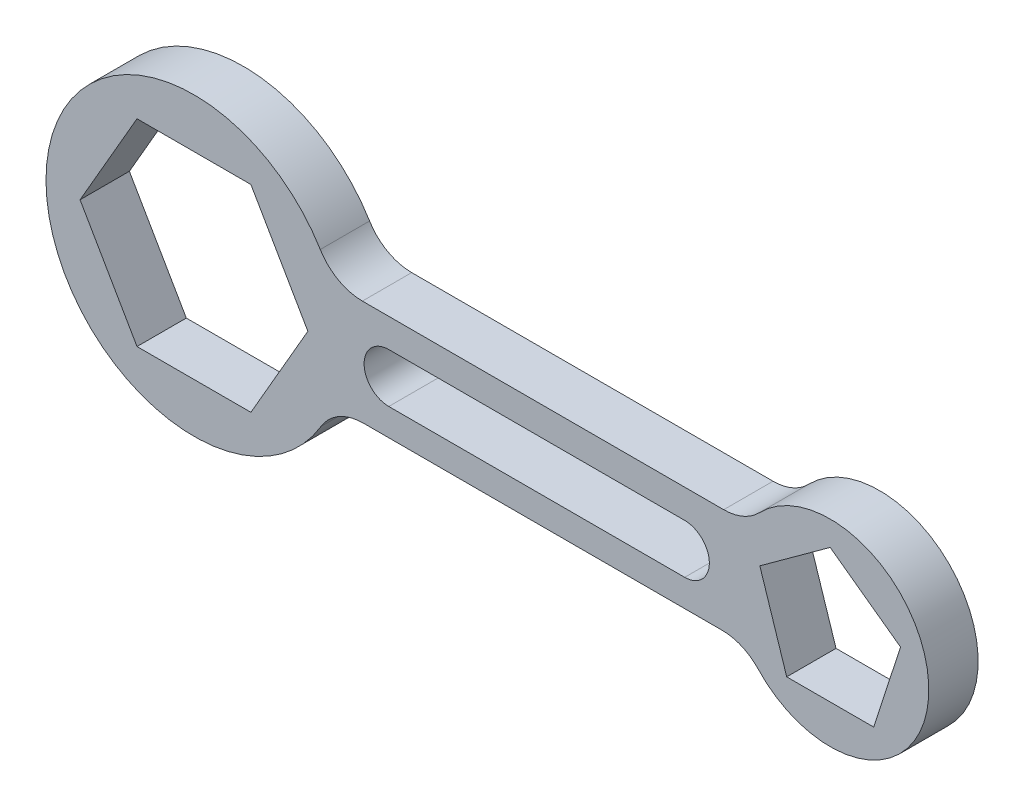
ISO-10303-21;
HEADER;
FILE_DESCRIPTION(('STEP AP214'),'2;1');
FILE_NAME('part.step','',(''),(''),'','','');
FILE_SCHEMA(('AUTOMOTIVE_DESIGN { 1 0 10303 214 1 1 1 1 }'));
ENDSEC;
DATA;
#1=APPLICATION_CONTEXT('core data for automotive mechanical design processes');
#2=APPLICATION_PROTOCOL_DEFINITION('international standard','automotive_design',2000,#1);
#3=PRODUCT_CONTEXT('',#1,'mechanical');
#4=PRODUCT('Part','Part','',(#3));
#5=PRODUCT_RELATED_PRODUCT_CATEGORY('part','',(#4));
#6=PRODUCT_DEFINITION_FORMATION('','',#4);
#7=PRODUCT_DEFINITION_CONTEXT('part definition',#1,'design');
#8=PRODUCT_DEFINITION('design','',#6,#7);
#9=PRODUCT_DEFINITION_SHAPE('','',#8);
#10=(LENGTH_UNIT() NAMED_UNIT(*) SI_UNIT(.MILLI.,.METRE.));
#11=(NAMED_UNIT(*) PLANE_ANGLE_UNIT() SI_UNIT($,.RADIAN.));
#12=(NAMED_UNIT(*) SI_UNIT($,.STERADIAN.) SOLID_ANGLE_UNIT());
#13=UNCERTAINTY_MEASURE_WITH_UNIT(LENGTH_MEASURE(1.E-05),#10,'distance_accuracy_value','');
#14=(GEOMETRIC_REPRESENTATION_CONTEXT(3) GLOBAL_UNCERTAINTY_ASSIGNED_CONTEXT((#13)) GLOBAL_UNIT_ASSIGNED_CONTEXT((#10,
#11,#12)) REPRESENTATION_CONTEXT('',''));
#15=CARTESIAN_POINT('',(0.,0.,0.));
#16=DIRECTION('',(0.,0.,1.));
#17=DIRECTION('',(1.,0.,0.));
#18=AXIS2_PLACEMENT_3D('',#15,#16,#17);
#19=CARTESIAN_POINT('',(34.148205858057,20.8302673212747,10.));
#20=DIRECTION('',(0.,0.,-1.));
#21=DIRECTION('',(-1.,0.,0.));
#22=AXIS2_PLACEMENT_3D('',#19,#20,#21);
#23=PLANE('',#22);
#24=DIRECTION('',(-0.5,0.866025403784439,0.));
#25=VECTOR('',#24,1.);
#26=CARTESIAN_POINT('',(23.094010767585,0.,10.));
#27=LINE('',#26,#25);
#28=CARTESIAN_POINT('',(23.094010767585,0.,10.));
#29=VERTEX_POINT('',#28);
#30=CARTESIAN_POINT('',(11.5470053837925,20.,10.));
#31=VERTEX_POINT('',#30);
#32=EDGE_CURVE('E224',#29,#31,#27,.T.);
#33=ORIENTED_EDGE('',*,*,#32,.F.);
#34=DIRECTION('',(0.5,0.866025403784439,0.));
#35=VECTOR('',#34,1.);
#36=CARTESIAN_POINT('',(11.5470053837925,-20.,10.));
#37=LINE('',#36,#35);
#38=CARTESIAN_POINT('',(11.5470053837925,-20.,10.));
#39=VERTEX_POINT('',#38);
#40=EDGE_CURVE('E236',#39,#29,#37,.T.);
#41=ORIENTED_EDGE('',*,*,#40,.F.);
#42=DIRECTION('',(1.,0.,0.));
#43=VECTOR('',#42,1.);
#44=CARTESIAN_POINT('',(-11.5470053837925,-20.,10.));
#45=LINE('',#44,#43);
#46=CARTESIAN_POINT('',(-11.5470053837925,-20.,10.));
#47=VERTEX_POINT('',#46);
#48=EDGE_CURVE('E233',#47,#39,#45,.T.);
#49=ORIENTED_EDGE('',*,*,#48,.F.);
#50=DIRECTION('',(0.5,-0.866025403784439,0.));
#51=VECTOR('',#50,1.);
#52=CARTESIAN_POINT('',(-23.094010767585,0.,10.));
#53=LINE('',#52,#51);
#54=CARTESIAN_POINT('',(-23.094010767585,0.,10.));
#55=VERTEX_POINT('',#54);
#56=EDGE_CURVE('E231',#55,#47,#53,.T.);
#57=ORIENTED_EDGE('',*,*,#56,.F.);
#58=DIRECTION('',(-0.5,-0.866025403784439,0.));
#59=VECTOR('',#58,1.);
#60=CARTESIAN_POINT('',(-11.5470053837925,20.,10.));
#61=LINE('',#60,#59);
#62=CARTESIAN_POINT('',(-11.5470053837925,20.,10.));
#63=VERTEX_POINT('',#62);
#64=EDGE_CURVE('E229',#63,#55,#61,.T.);
#65=ORIENTED_EDGE('',*,*,#64,.F.);
#66=DIRECTION('',(-1.,0.,0.));
#67=VECTOR('',#66,1.);
#68=CARTESIAN_POINT('',(11.5470053837925,20.,10.));
#69=LINE('',#68,#67);
#70=EDGE_CURVE('E226',#31,#63,#69,.T.);
#71=ORIENTED_EDGE('',*,*,#70,.F.);
#72=EDGE_LOOP('',(#33,#41,#49,#57,#65,#71));
#73=FACE_BOUND('',#72,.T.);
#74=CARTESIAN_POINT('',(34.148205858057,20.8302673212747,10.));
#75=DIRECTION('',(0.,0.,-1.));
#76=DIRECTION('',(-1.,0.,0.));
#77=AXIS2_PLACEMENT_3D('',#74,#75,#76);
#78=CIRCLE('',#77,10.);
#79=CARTESIAN_POINT('',(34.148205858057,10.8302673212747,10.));
#80=VERTEX_POINT('',#79);
#81=CARTESIAN_POINT('',(25.6111543935427,15.622700490956,10.));
#82=VERTEX_POINT('',#81);
#83=EDGE_CURVE('E307',#80,#82,#78,.T.);
#84=ORIENTED_EDGE('',*,*,#83,.T.);
#85=CARTESIAN_POINT('',(0.,0.,10.));
#86=DIRECTION('',(0.,0.,1.));
#87=DIRECTION('',(1.,0.,0.));
#88=AXIS2_PLACEMENT_3D('',#85,#86,#87);
#89=CIRCLE('',#88,30.);
#90=CARTESIAN_POINT('',(25.760036840317,-15.3759715785868,10.));
#91=VERTEX_POINT('',#90);
#92=EDGE_CURVE('E310',#82,#91,#89,.T.);
#93=ORIENTED_EDGE('',*,*,#92,.T.);
#94=CARTESIAN_POINT('',(34.3467157870894,-20.5012954381157,10.));
#95=DIRECTION('',(0.,0.,-1.));
#96=DIRECTION('',(1.,0.,0.));
#97=AXIS2_PLACEMENT_3D('',#94,#95,#96);
#98=CIRCLE('',#97,10.);
#99=CARTESIAN_POINT('',(34.3467157870894,-10.5012954381157,10.));
#100=VERTEX_POINT('',#99);
#101=EDGE_CURVE('E313',#91,#100,#98,.T.);
#102=ORIENTED_EDGE('',*,*,#101,.T.);
#103=DIRECTION('',(1.,0.,0.));
#104=VECTOR('',#103,1.);
#105=CARTESIAN_POINT('',(34.3467157870894,-10.5012954381157,10.));
#106=LINE('',#105,#104);
#107=CARTESIAN_POINT('',(107.098016405834,-10.5012954381157,10.));
#108=VERTEX_POINT('',#107);
#109=EDGE_CURVE('E315',#100,#108,#106,.T.);
#110=ORIENTED_EDGE('',*,*,#109,.T.);
#111=CARTESIAN_POINT('',(107.098016405834,-20.5012954381157,10.));
#112=DIRECTION('',(0.,0.,-1.));
#113=DIRECTION('',(1.,0.,0.));
#114=AXIS2_PLACEMENT_3D('',#111,#112,#113);
#115=CIRCLE('',#114,10.);
#116=CARTESIAN_POINT('',(114.39867760389,-13.6675302920771,10.));
#117=VERTEX_POINT('',#116);
#118=EDGE_CURVE('E317',#108,#117,#115,.T.);
#119=ORIENTED_EDGE('',*,*,#118,.T.);
#120=CARTESIAN_POINT('',(129.,0.,10.));
#121=DIRECTION('',(0.,0.,1.));
#122=DIRECTION('',(1.,0.,0.));
#123=AXIS2_PLACEMENT_3D('',#120,#121,#122);
#124=CIRCLE('',#123,20.);
#125=CARTESIAN_POINT('',(114.607101082297,13.8868448808498,10.));
#126=VERTEX_POINT('',#125);
#127=EDGE_CURVE('E319',#117,#126,#124,.T.);
#128=ORIENTED_EDGE('',*,*,#127,.T.);
#129=CARTESIAN_POINT('',(107.410651623446,20.8302673212747,10.));
#130=DIRECTION('',(0.,0.,-1.));
#131=DIRECTION('',(1.,0.,0.));
#132=AXIS2_PLACEMENT_3D('',#129,#130,#131);
#133=CIRCLE('',#132,10.);
#134=CARTESIAN_POINT('',(107.410651623446,10.8302673212747,10.));
#135=VERTEX_POINT('',#134);
#136=EDGE_CURVE('E321',#126,#135,#133,.T.);
#137=ORIENTED_EDGE('',*,*,#136,.T.);
#138=DIRECTION('',(-1.,0.,0.));
#139=VECTOR('',#138,1.);
#140=CARTESIAN_POINT('',(34.148205858057,10.8302673212747,10.));
#141=LINE('',#140,#139);
#142=EDGE_CURVE('E323',#135,#80,#141,.T.);
#143=ORIENTED_EDGE('',*,*,#142,.T.);
#144=EDGE_LOOP('',(#84,#93,#102,#110,#119,#128,#137,#143));
#145=FACE_BOUND('',#144,.T.);
#146=DIRECTION('',(-0.809016994374948,0.587785252292472,0.));
#147=VECTOR('',#146,1.);
#148=CARTESIAN_POINT('',(143.265847744427,4.63525491562424,10.));
#149=LINE('',#148,#147);
#150=CARTESIAN_POINT('',(143.265847744427,4.63525491562424,10.));
#151=VERTEX_POINT('',#150);
#152=CARTESIAN_POINT('',(129.,15.,10.));
#153=VERTEX_POINT('',#152);
#154=EDGE_CURVE('E269',#151,#153,#149,.T.);
#155=ORIENTED_EDGE('',*,*,#154,.F.);
#156=DIRECTION('',(0.309016994374945,0.951056516295155,0.));
#157=VECTOR('',#156,1.);
#158=CARTESIAN_POINT('',(137.816778784387,-12.1352549156242,10.));
#159=LINE('',#158,#157);
#160=CARTESIAN_POINT('',(137.816778784387,-12.1352549156242,10.));
#161=VERTEX_POINT('',#160);
#162=EDGE_CURVE('E279',#161,#151,#159,.T.);
#163=ORIENTED_EDGE('',*,*,#162,.F.);
#164=DIRECTION('',(1.,0.,0.));
#165=VECTOR('',#164,1.);
#166=CARTESIAN_POINT('',(120.183221215613,-12.1352549156243,10.));
#167=LINE('',#166,#165);
#168=CARTESIAN_POINT('',(120.183221215613,-12.1352549156243,10.));
#169=VERTEX_POINT('',#168);
#170=EDGE_CURVE('E276',#169,#161,#167,.T.);
#171=ORIENTED_EDGE('',*,*,#170,.F.);
#172=DIRECTION('',(0.309016994374948,-0.951056516295153,0.));
#173=VECTOR('',#172,1.);
#174=CARTESIAN_POINT('',(114.734152255573,4.63525491562419,10.));
#175=LINE('',#174,#173);
#176=CARTESIAN_POINT('',(114.734152255573,4.63525491562419,10.));
#177=VERTEX_POINT('',#176);
#178=EDGE_CURVE('E274',#177,#169,#175,.T.);
#179=ORIENTED_EDGE('',*,*,#178,.F.);
#180=DIRECTION('',(-0.809016994374946,-0.587785252292475,0.));
#181=VECTOR('',#180,1.);
#182=CARTESIAN_POINT('',(129.,15.,10.));
#183=LINE('',#182,#181);
#184=EDGE_CURVE('E271',#153,#177,#183,.T.);
#185=ORIENTED_EDGE('',*,*,#184,.F.);
#186=EDGE_LOOP('',(#155,#163,#171,#179,#185));
#187=FACE_BOUND('',#186,.T.);
#188=CARTESIAN_POINT('',(39.5,0.,10.));
#189=DIRECTION('',(0.,0.,1.));
#190=DIRECTION('',(1.,0.,0.));
#191=AXIS2_PLACEMENT_3D('',#188,#189,#190);
#192=CIRCLE('',#191,5.);
#193=CARTESIAN_POINT('',(39.5,5.,10.));
#194=VERTEX_POINT('',#193);
#195=CARTESIAN_POINT('',(39.5,-5.,10.));
#196=VERTEX_POINT('',#195);
#197=EDGE_CURVE('E188',#194,#196,#192,.T.);
#198=ORIENTED_EDGE('',*,*,#197,.F.);
#199=DIRECTION('',(-1.,0.,0.));
#200=VECTOR('',#199,1.);
#201=CARTESIAN_POINT('',(39.5,5.,10.));
#202=LINE('',#201,#200);
#203=CARTESIAN_POINT('',(99.5,5.,10.));
#204=VERTEX_POINT('',#203);
#205=EDGE_CURVE('E210',#204,#194,#202,.T.);
#206=ORIENTED_EDGE('',*,*,#205,.F.);
#207=CARTESIAN_POINT('',(99.5,0.,10.));
#208=DIRECTION('',(0.,0.,1.));
#209=DIRECTION('',(1.,0.,0.));
#210=AXIS2_PLACEMENT_3D('',#207,#208,#209);
#211=CIRCLE('',#210,5.);
#212=CARTESIAN_POINT('',(99.5,-5.,10.));
#213=VERTEX_POINT('',#212);
#214=EDGE_CURVE('E208',#213,#204,#211,.T.);
#215=ORIENTED_EDGE('',*,*,#214,.F.);
#216=DIRECTION('',(1.,0.,0.));
#217=VECTOR('',#216,1.);
#218=CARTESIAN_POINT('',(39.5,-5.,10.));
#219=LINE('',#218,#217);
#220=EDGE_CURVE('E196',#196,#213,#219,.T.);
#221=ORIENTED_EDGE('',*,*,#220,.F.);
#222=EDGE_LOOP('',(#198,#206,#215,#221));
#223=FACE_BOUND('',#222,.T.);
#224=ADVANCED_FACE('F33',(#73,#145,#187,#223),#23,.F.);
#225=CARTESIAN_POINT('',(34.148205858057,20.8302673212747,0.));
#226=DIRECTION('',(0.,0.,-1.));
#227=DIRECTION('',(-1.,0.,0.));
#228=AXIS2_PLACEMENT_3D('',#225,#226,#227);
#229=PLANE('',#228);
#230=CARTESIAN_POINT('',(34.148205858057,20.8302673212747,0.));
#231=DIRECTION('',(0.,0.,-1.));
#232=DIRECTION('',(-1.,0.,0.));
#233=AXIS2_PLACEMENT_3D('',#230,#231,#232);
#234=CIRCLE('',#233,10.);
#235=CARTESIAN_POINT('',(34.148205858057,10.8302673212747,0.));
#236=VERTEX_POINT('',#235);
#237=CARTESIAN_POINT('',(25.6111543935427,15.622700490956,0.));
#238=VERTEX_POINT('',#237);
#239=EDGE_CURVE('E306',#236,#238,#234,.T.);
#240=ORIENTED_EDGE('',*,*,#239,.F.);
#241=DIRECTION('',(-1.,0.,0.));
#242=VECTOR('',#241,1.);
#243=CARTESIAN_POINT('',(34.148205858057,10.8302673212747,0.));
#244=LINE('',#243,#242);
#245=CARTESIAN_POINT('',(107.410651623446,10.8302673212747,0.));
#246=VERTEX_POINT('',#245);
#247=EDGE_CURVE('E311',#246,#236,#244,.T.);
#248=ORIENTED_EDGE('',*,*,#247,.F.);
#249=CARTESIAN_POINT('',(107.410651623446,20.8302673212747,0.));
#250=DIRECTION('',(0.,0.,-1.));
#251=DIRECTION('',(1.,0.,0.));
#252=AXIS2_PLACEMENT_3D('',#249,#250,#251);
#253=CIRCLE('',#252,10.);
#254=CARTESIAN_POINT('',(114.607101082297,13.8868448808498,0.));
#255=VERTEX_POINT('',#254);
#256=EDGE_CURVE('E338',#255,#246,#253,.T.);
#257=ORIENTED_EDGE('',*,*,#256,.F.);
#258=CARTESIAN_POINT('',(129.,0.,0.));
#259=DIRECTION('',(0.,0.,1.));
#260=DIRECTION('',(1.,0.,0.));
#261=AXIS2_PLACEMENT_3D('',#258,#259,#260);
#262=CIRCLE('',#261,20.);
#263=CARTESIAN_POINT('',(114.39867760389,-13.6675302920771,0.));
#264=VERTEX_POINT('',#263);
#265=EDGE_CURVE('E336',#264,#255,#262,.T.);
#266=ORIENTED_EDGE('',*,*,#265,.F.);
#267=CARTESIAN_POINT('',(107.098016405834,-20.5012954381157,0.));
#268=DIRECTION('',(0.,0.,-1.));
#269=DIRECTION('',(1.,0.,0.));
#270=AXIS2_PLACEMENT_3D('',#267,#268,#269);
#271=CIRCLE('',#270,10.);
#272=CARTESIAN_POINT('',(107.098016405834,-10.5012954381157,0.));
#273=VERTEX_POINT('',#272);
#274=EDGE_CURVE('E334',#273,#264,#271,.T.);
#275=ORIENTED_EDGE('',*,*,#274,.F.);
#276=DIRECTION('',(1.,0.,0.));
#277=VECTOR('',#276,1.);
#278=CARTESIAN_POINT('',(34.3467157870894,-10.5012954381157,0.));
#279=LINE('',#278,#277);
#280=CARTESIAN_POINT('',(34.3467157870894,-10.5012954381157,0.));
#281=VERTEX_POINT('',#280);
#282=EDGE_CURVE('E332',#281,#273,#279,.T.);
#283=ORIENTED_EDGE('',*,*,#282,.F.);
#284=CARTESIAN_POINT('',(34.3467157870894,-20.5012954381157,0.));
#285=DIRECTION('',(0.,0.,-1.));
#286=DIRECTION('',(1.,0.,0.));
#287=AXIS2_PLACEMENT_3D('',#284,#285,#286);
#288=CIRCLE('',#287,10.);
#289=CARTESIAN_POINT('',(25.760036840317,-15.3759715785868,0.));
#290=VERTEX_POINT('',#289);
#291=EDGE_CURVE('E330',#290,#281,#288,.T.);
#292=ORIENTED_EDGE('',*,*,#291,.F.);
#293=CARTESIAN_POINT('',(0.,0.,0.));
#294=DIRECTION('',(0.,0.,1.));
#295=DIRECTION('',(1.,0.,0.));
#296=AXIS2_PLACEMENT_3D('',#293,#294,#295);
#297=CIRCLE('',#296,30.);
#298=EDGE_CURVE('E328',#238,#290,#297,.T.);
#299=ORIENTED_EDGE('',*,*,#298,.F.);
#300=EDGE_LOOP('',(#240,#248,#257,#266,#275,#283,#292,#299));
#301=FACE_BOUND('',#300,.T.);
#302=DIRECTION('',(0.309016994374945,0.951056516295155,0.));
#303=VECTOR('',#302,1.);
#304=CARTESIAN_POINT('',(137.816778784387,-12.1352549156242,0.));
#305=LINE('',#304,#303);
#306=CARTESIAN_POINT('',(137.816778784387,-12.1352549156242,0.));
#307=VERTEX_POINT('',#306);
#308=CARTESIAN_POINT('',(143.265847744427,4.63525491562424,0.));
#309=VERTEX_POINT('',#308);
#310=EDGE_CURVE('E272',#307,#309,#305,.T.);
#311=ORIENTED_EDGE('',*,*,#310,.T.);
#312=DIRECTION('',(-0.809016994374948,0.587785252292472,0.));
#313=VECTOR('',#312,1.);
#314=CARTESIAN_POINT('',(143.265847744427,4.63525491562424,0.));
#315=LINE('',#314,#313);
#316=CARTESIAN_POINT('',(129.,15.,0.));
#317=VERTEX_POINT('',#316);
#318=EDGE_CURVE('E268',#309,#317,#315,.T.);
#319=ORIENTED_EDGE('',*,*,#318,.T.);
#320=DIRECTION('',(-0.809016994374946,-0.587785252292475,0.));
#321=VECTOR('',#320,1.);
#322=CARTESIAN_POINT('',(129.,15.,0.));
#323=LINE('',#322,#321);
#324=CARTESIAN_POINT('',(114.734152255573,4.63525491562419,0.));
#325=VERTEX_POINT('',#324);
#326=EDGE_CURVE('E284',#317,#325,#323,.T.);
#327=ORIENTED_EDGE('',*,*,#326,.T.);
#328=DIRECTION('',(0.309016994374948,-0.951056516295153,0.));
#329=VECTOR('',#328,1.);
#330=CARTESIAN_POINT('',(114.734152255573,4.63525491562419,0.));
#331=LINE('',#330,#329);
#332=CARTESIAN_POINT('',(120.183221215613,-12.1352549156243,0.));
#333=VERTEX_POINT('',#332);
#334=EDGE_CURVE('E287',#325,#333,#331,.T.);
#335=ORIENTED_EDGE('',*,*,#334,.T.);
#336=DIRECTION('',(1.,0.,0.));
#337=VECTOR('',#336,1.);
#338=CARTESIAN_POINT('',(120.183221215613,-12.1352549156243,0.));
#339=LINE('',#338,#337);
#340=EDGE_CURVE('E290',#333,#307,#339,.T.);
#341=ORIENTED_EDGE('',*,*,#340,.T.);
#342=EDGE_LOOP('',(#311,#319,#327,#335,#341));
#343=FACE_BOUND('',#342,.T.);
#344=DIRECTION('',(0.5,0.866025403784439,0.));
#345=VECTOR('',#344,1.);
#346=CARTESIAN_POINT('',(11.5470053837925,-20.,0.));
#347=LINE('',#346,#345);
#348=CARTESIAN_POINT('',(11.5470053837925,-20.,0.));
#349=VERTEX_POINT('',#348);
#350=CARTESIAN_POINT('',(23.094010767585,0.,0.));
#351=VERTEX_POINT('',#350);
#352=EDGE_CURVE('E227',#349,#351,#347,.T.);
#353=ORIENTED_EDGE('',*,*,#352,.T.);
#354=DIRECTION('',(-0.5,0.866025403784439,0.));
#355=VECTOR('',#354,1.);
#356=CARTESIAN_POINT('',(23.094010767585,0.,0.));
#357=LINE('',#356,#355);
#358=CARTESIAN_POINT('',(11.5470053837925,20.,0.));
#359=VERTEX_POINT('',#358);
#360=EDGE_CURVE('E204',#351,#359,#357,.T.);
#361=ORIENTED_EDGE('',*,*,#360,.T.);
#362=DIRECTION('',(-1.,0.,0.));
#363=VECTOR('',#362,1.);
#364=CARTESIAN_POINT('',(11.5470053837925,20.,0.));
#365=LINE('',#364,#363);
#366=CARTESIAN_POINT('',(-11.5470053837925,20.,0.));
#367=VERTEX_POINT('',#366);
#368=EDGE_CURVE('E241',#359,#367,#365,.T.);
#369=ORIENTED_EDGE('',*,*,#368,.T.);
#370=DIRECTION('',(-0.5,-0.866025403784439,0.));
#371=VECTOR('',#370,1.);
#372=CARTESIAN_POINT('',(-11.5470053837925,20.,0.));
#373=LINE('',#372,#371);
#374=CARTESIAN_POINT('',(-23.094010767585,0.,0.));
#375=VERTEX_POINT('',#374);
#376=EDGE_CURVE('E244',#367,#375,#373,.T.);
#377=ORIENTED_EDGE('',*,*,#376,.T.);
#378=DIRECTION('',(0.5,-0.866025403784439,0.));
#379=VECTOR('',#378,1.);
#380=CARTESIAN_POINT('',(-23.094010767585,0.,0.));
#381=LINE('',#380,#379);
#382=CARTESIAN_POINT('',(-11.5470053837925,-20.,0.));
#383=VERTEX_POINT('',#382);
#384=EDGE_CURVE('E247',#375,#383,#381,.T.);
#385=ORIENTED_EDGE('',*,*,#384,.T.);
#386=DIRECTION('',(1.,0.,0.));
#387=VECTOR('',#386,1.);
#388=CARTESIAN_POINT('',(-11.5470053837925,-20.,0.));
#389=LINE('',#388,#387);
#390=EDGE_CURVE('E250',#383,#349,#389,.T.);
#391=ORIENTED_EDGE('',*,*,#390,.T.);
#392=EDGE_LOOP('',(#353,#361,#369,#377,#385,#391));
#393=FACE_BOUND('',#392,.T.);
#394=DIRECTION('',(-1.,0.,0.));
#395=VECTOR('',#394,1.);
#396=CARTESIAN_POINT('',(39.5,5.,0.));
#397=LINE('',#396,#395);
#398=CARTESIAN_POINT('',(99.5,5.,0.));
#399=VERTEX_POINT('',#398);
#400=CARTESIAN_POINT('',(39.5,5.,0.));
#401=VERTEX_POINT('',#400);
#402=EDGE_CURVE('E197',#399,#401,#397,.T.);
#403=ORIENTED_EDGE('',*,*,#402,.T.);
#404=CARTESIAN_POINT('',(39.5,0.,0.));
#405=DIRECTION('',(0.,0.,1.));
#406=DIRECTION('',(1.,0.,0.));
#407=AXIS2_PLACEMENT_3D('',#404,#405,#406);
#408=CIRCLE('',#407,5.);
#409=CARTESIAN_POINT('',(39.5,-5.,0.));
#410=VERTEX_POINT('',#409);
#411=EDGE_CURVE('E56',#401,#410,#408,.T.);
#412=ORIENTED_EDGE('',*,*,#411,.T.);
#413=DIRECTION('',(1.,0.,0.));
#414=VECTOR('',#413,1.);
#415=CARTESIAN_POINT('',(39.5,-5.,0.));
#416=LINE('',#415,#414);
#417=CARTESIAN_POINT('',(99.5,-5.,0.));
#418=VERTEX_POINT('',#417);
#419=EDGE_CURVE('E203',#410,#418,#416,.T.);
#420=ORIENTED_EDGE('',*,*,#419,.T.);
#421=CARTESIAN_POINT('',(99.5,0.,0.));
#422=DIRECTION('',(0.,0.,1.));
#423=DIRECTION('',(1.,0.,0.));
#424=AXIS2_PLACEMENT_3D('',#421,#422,#423);
#425=CIRCLE('',#424,5.);
#426=EDGE_CURVE('E216',#418,#399,#425,.T.);
#427=ORIENTED_EDGE('',*,*,#426,.T.);
#428=EDGE_LOOP('',(#403,#412,#420,#427));
#429=FACE_BOUND('',#428,.T.);
#430=ADVANCED_FACE('F368',(#301,#343,#393,#429),#229,.T.);
#431=CARTESIAN_POINT('',(34.148205858057,20.8302673212747,10.));
#432=DIRECTION('',(0.,0.,-1.));
#433=DIRECTION('',(-1.,0.,0.));
#434=AXIS2_PLACEMENT_3D('',#431,#432,#433);
#435=CYLINDRICAL_SURFACE('',#434,10.);
#436=ORIENTED_EDGE('',*,*,#239,.T.);
#437=DIRECTION('',(0.,0.,-1.));
#438=VECTOR('',#437,1.);
#439=CARTESIAN_POINT('',(25.6111543935427,15.622700490956,10.));
#440=LINE('',#439,#438);
#441=EDGE_CURVE('E11',#82,#238,#440,.T.);
#442=ORIENTED_EDGE('',*,*,#441,.F.);
#443=ORIENTED_EDGE('',*,*,#83,.F.);
#444=DIRECTION('',(0.,0.,-1.));
#445=VECTOR('',#444,1.);
#446=CARTESIAN_POINT('',(34.148205858057,10.8302673212747,10.));
#447=LINE('',#446,#445);
#448=EDGE_CURVE('E325',#80,#236,#447,.T.);
#449=ORIENTED_EDGE('',*,*,#448,.T.);
#450=EDGE_LOOP('',(#436,#442,#443,#449));
#451=FACE_BOUND('',#450,.T.);
#452=ADVANCED_FACE('F35',(#451),#435,.F.);
#453=CARTESIAN_POINT('',(0.,0.,10.));
#454=DIRECTION('',(0.,0.,-1.));
#455=DIRECTION('',(-1.,0.,0.));
#456=AXIS2_PLACEMENT_3D('',#453,#454,#455);
#457=CYLINDRICAL_SURFACE('',#456,30.);
#458=ORIENTED_EDGE('',*,*,#298,.T.);
#459=DIRECTION('',(0.,0.,-1.));
#460=VECTOR('',#459,1.);
#461=CARTESIAN_POINT('',(25.760036840317,-15.3759715785868,10.));
#462=LINE('',#461,#460);
#463=EDGE_CURVE('E41',#91,#290,#462,.T.);
#464=ORIENTED_EDGE('',*,*,#463,.F.);
#465=ORIENTED_EDGE('',*,*,#92,.F.);
#466=ORIENTED_EDGE('',*,*,#441,.T.);
#467=EDGE_LOOP('',(#458,#464,#465,#466));
#468=FACE_BOUND('',#467,.T.);
#469=ADVANCED_FACE('F386',(#468),#457,.T.);
#470=CARTESIAN_POINT('',(34.3467157870894,-20.5012954381157,10.));
#471=DIRECTION('',(0.,0.,-1.));
#472=DIRECTION('',(-1.,0.,0.));
#473=AXIS2_PLACEMENT_3D('',#470,#471,#472);
#474=CYLINDRICAL_SURFACE('',#473,10.);
#475=ORIENTED_EDGE('',*,*,#291,.T.);
#476=DIRECTION('',(0.,0.,-1.));
#477=VECTOR('',#476,1.);
#478=CARTESIAN_POINT('',(34.3467157870894,-10.5012954381157,10.));
#479=LINE('',#478,#477);
#480=EDGE_CURVE('E355',#100,#281,#479,.T.);
#481=ORIENTED_EDGE('',*,*,#480,.F.);
#482=ORIENTED_EDGE('',*,*,#101,.F.);
#483=ORIENTED_EDGE('',*,*,#463,.T.);
#484=EDGE_LOOP('',(#475,#481,#482,#483));
#485=FACE_BOUND('',#484,.T.);
#486=ADVANCED_FACE('F362',(#485),#474,.F.);
#487=CARTESIAN_POINT('',(34.3467157870894,-10.5012954381157,10.));
#488=DIRECTION('',(0.,1.,0.));
#489=DIRECTION('',(0.,0.,1.));
#490=AXIS2_PLACEMENT_3D('',#487,#488,#489);
#491=PLANE('',#490);
#492=ORIENTED_EDGE('',*,*,#282,.T.);
#493=DIRECTION('',(0.,0.,-1.));
#494=VECTOR('',#493,1.);
#495=CARTESIAN_POINT('',(107.098016405834,-10.5012954381157,10.));
#496=LINE('',#495,#494);
#497=EDGE_CURVE('E352',#108,#273,#496,.T.);
#498=ORIENTED_EDGE('',*,*,#497,.F.);
#499=ORIENTED_EDGE('',*,*,#109,.F.);
#500=ORIENTED_EDGE('',*,*,#480,.T.);
#501=EDGE_LOOP('',(#492,#498,#499,#500));
#502=FACE_BOUND('',#501,.T.);
#503=ADVANCED_FACE('F374',(#502),#491,.F.);
#504=CARTESIAN_POINT('',(107.098016405834,-20.5012954381157,10.));
#505=DIRECTION('',(0.,0.,-1.));
#506=DIRECTION('',(-1.,0.,0.));
#507=AXIS2_PLACEMENT_3D('',#504,#505,#506);
#508=CYLINDRICAL_SURFACE('',#507,10.);
#509=ORIENTED_EDGE('',*,*,#274,.T.);
#510=DIRECTION('',(0.,0.,-1.));
#511=VECTOR('',#510,1.);
#512=CARTESIAN_POINT('',(114.39867760389,-13.6675302920771,10.));
#513=LINE('',#512,#511);
#514=EDGE_CURVE('E349',#117,#264,#513,.T.);
#515=ORIENTED_EDGE('',*,*,#514,.F.);
#516=ORIENTED_EDGE('',*,*,#118,.F.);
#517=ORIENTED_EDGE('',*,*,#497,.T.);
#518=EDGE_LOOP('',(#509,#515,#516,#517));
#519=FACE_BOUND('',#518,.T.);
#520=ADVANCED_FACE('F378',(#519),#508,.F.);
#521=CARTESIAN_POINT('',(129.,0.,10.));
#522=DIRECTION('',(0.,0.,-1.));
#523=DIRECTION('',(-1.,0.,0.));
#524=AXIS2_PLACEMENT_3D('',#521,#522,#523);
#525=CYLINDRICAL_SURFACE('',#524,20.);
#526=ORIENTED_EDGE('',*,*,#265,.T.);
#527=DIRECTION('',(0.,0.,-1.));
#528=VECTOR('',#527,1.);
#529=CARTESIAN_POINT('',(114.607101082297,13.8868448808498,10.));
#530=LINE('',#529,#528);
#531=EDGE_CURVE('E346',#126,#255,#530,.T.);
#532=ORIENTED_EDGE('',*,*,#531,.F.);
#533=ORIENTED_EDGE('',*,*,#127,.F.);
#534=ORIENTED_EDGE('',*,*,#514,.T.);
#535=EDGE_LOOP('',(#526,#532,#533,#534));
#536=FACE_BOUND('',#535,.T.);
#537=ADVANCED_FACE('F399',(#536),#525,.T.);
#538=CARTESIAN_POINT('',(107.410651623446,20.8302673212747,10.));
#539=DIRECTION('',(0.,0.,-1.));
#540=DIRECTION('',(-1.,0.,0.));
#541=AXIS2_PLACEMENT_3D('',#538,#539,#540);
#542=CYLINDRICAL_SURFACE('',#541,10.);
#543=ORIENTED_EDGE('',*,*,#256,.T.);
#544=DIRECTION('',(0.,0.,-1.));
#545=VECTOR('',#544,1.);
#546=CARTESIAN_POINT('',(107.410651623446,10.8302673212747,10.));
#547=LINE('',#546,#545);
#548=EDGE_CURVE('E343',#135,#246,#547,.T.);
#549=ORIENTED_EDGE('',*,*,#548,.F.);
#550=ORIENTED_EDGE('',*,*,#136,.F.);
#551=ORIENTED_EDGE('',*,*,#531,.T.);
#552=EDGE_LOOP('',(#543,#549,#550,#551));
#553=FACE_BOUND('',#552,.T.);
#554=ADVANCED_FACE('F397',(#553),#542,.F.);
#555=CARTESIAN_POINT('',(34.148205858057,10.8302673212747,10.));
#556=DIRECTION('',(0.,-1.,0.));
#557=DIRECTION('',(0.,0.,-1.));
#558=AXIS2_PLACEMENT_3D('',#555,#556,#557);
#559=PLANE('',#558);
#560=ORIENTED_EDGE('',*,*,#247,.T.);
#561=ORIENTED_EDGE('',*,*,#448,.F.);
#562=ORIENTED_EDGE('',*,*,#142,.F.);
#563=ORIENTED_EDGE('',*,*,#548,.T.);
#564=EDGE_LOOP('',(#560,#561,#562,#563));
#565=FACE_BOUND('',#564,.T.);
#566=ADVANCED_FACE('F392',(#565),#559,.F.);
#567=CARTESIAN_POINT('',(143.265847744427,4.63525491562424,10.));
#568=DIRECTION('',(-0.587785252292472,-0.809016994374948,0.));
#569=DIRECTION('',(0.809016994374948,-0.587785252292472,0.));
#570=AXIS2_PLACEMENT_3D('',#567,#568,#569);
#571=PLANE('',#570);
#572=ORIENTED_EDGE('',*,*,#318,.F.);
#573=DIRECTION('',(0.,0.,-1.));
#574=VECTOR('',#573,1.);
#575=CARTESIAN_POINT('',(143.265847744427,4.63525491562424,10.));
#576=LINE('',#575,#574);
#577=EDGE_CURVE('E281',#151,#309,#576,.T.);
#578=ORIENTED_EDGE('',*,*,#577,.F.);
#579=ORIENTED_EDGE('',*,*,#154,.T.);
#580=DIRECTION('',(0.,0.,-1.));
#581=VECTOR('',#580,1.);
#582=CARTESIAN_POINT('',(129.,15.,10.));
#583=LINE('',#582,#581);
#584=EDGE_CURVE('E303',#153,#317,#583,.T.);
#585=ORIENTED_EDGE('',*,*,#584,.T.);
#586=EDGE_LOOP('',(#572,#578,#579,#585));
#587=FACE_BOUND('',#586,.T.);
#588=ADVANCED_FACE('F417',(#587),#571,.T.);
#589=CARTESIAN_POINT('',(129.,15.,10.));
#590=DIRECTION('',(0.587785252292475,-0.809016994374946,0.));
#591=DIRECTION('',(0.809016994374946,0.587785252292475,0.));
#592=AXIS2_PLACEMENT_3D('',#589,#590,#591);
#593=PLANE('',#592);
#594=ORIENTED_EDGE('',*,*,#326,.F.);
#595=ORIENTED_EDGE('',*,*,#584,.F.);
#596=ORIENTED_EDGE('',*,*,#184,.T.);
#597=DIRECTION('',(0.,0.,-1.));
#598=VECTOR('',#597,1.);
#599=CARTESIAN_POINT('',(114.734152255573,4.63525491562419,10.));
#600=LINE('',#599,#598);
#601=EDGE_CURVE('E301',#177,#325,#600,.T.);
#602=ORIENTED_EDGE('',*,*,#601,.T.);
#603=EDGE_LOOP('',(#594,#595,#596,#602));
#604=FACE_BOUND('',#603,.T.);
#605=ADVANCED_FACE('F424',(#604),#593,.T.);
#606=CARTESIAN_POINT('',(114.734152255573,4.63525491562419,10.));
#607=DIRECTION('',(0.951056516295153,0.309016994374948,0.));
#608=DIRECTION('',(-0.309016994374948,0.951056516295153,0.));
#609=AXIS2_PLACEMENT_3D('',#606,#607,#608);
#610=PLANE('',#609);
#611=ORIENTED_EDGE('',*,*,#334,.F.);
#612=ORIENTED_EDGE('',*,*,#601,.F.);
#613=ORIENTED_EDGE('',*,*,#178,.T.);
#614=DIRECTION('',(0.,0.,-1.));
#615=VECTOR('',#614,1.);
#616=CARTESIAN_POINT('',(120.183221215613,-12.1352549156243,10.));
#617=LINE('',#616,#615);
#618=EDGE_CURVE('E299',#169,#333,#617,.T.);
#619=ORIENTED_EDGE('',*,*,#618,.T.);
#620=EDGE_LOOP('',(#611,#612,#613,#619));
#621=FACE_BOUND('',#620,.T.);
#622=ADVANCED_FACE('F429',(#621),#610,.T.);
#623=CARTESIAN_POINT('',(120.183221215613,-12.1352549156243,10.));
#624=DIRECTION('',(0.,1.,0.));
#625=DIRECTION('',(-1.,0.,0.));
#626=AXIS2_PLACEMENT_3D('',#623,#624,#625);
#627=PLANE('',#626);
#628=ORIENTED_EDGE('',*,*,#340,.F.);
#629=ORIENTED_EDGE('',*,*,#618,.F.);
#630=ORIENTED_EDGE('',*,*,#170,.T.);
#631=DIRECTION('',(0.,0.,-1.));
#632=VECTOR('',#631,1.);
#633=CARTESIAN_POINT('',(137.816778784387,-12.1352549156242,10.));
#634=LINE('',#633,#632);
#635=EDGE_CURVE('E297',#161,#307,#634,.T.);
#636=ORIENTED_EDGE('',*,*,#635,.T.);
#637=EDGE_LOOP('',(#628,#629,#630,#636));
#638=FACE_BOUND('',#637,.T.);
#639=ADVANCED_FACE('F443',(#638),#627,.T.);
#640=CARTESIAN_POINT('',(137.816778784387,-12.1352549156242,10.));
#641=DIRECTION('',(-0.951056516295155,0.309016994374945,0.));
#642=DIRECTION('',(-0.309016994374945,-0.951056516295155,0.));
#643=AXIS2_PLACEMENT_3D('',#640,#641,#642);
#644=PLANE('',#643);
#645=ORIENTED_EDGE('',*,*,#310,.F.);
#646=ORIENTED_EDGE('',*,*,#635,.F.);
#647=ORIENTED_EDGE('',*,*,#162,.T.);
#648=ORIENTED_EDGE('',*,*,#577,.T.);
#649=EDGE_LOOP('',(#645,#646,#647,#648));
#650=FACE_BOUND('',#649,.T.);
#651=ADVANCED_FACE('F436',(#650),#644,.T.);
#652=CARTESIAN_POINT('',(23.094010767585,0.,10.));
#653=DIRECTION('',(-0.866025403784439,-0.5,0.));
#654=DIRECTION('',(0.5,-0.866025403784439,0.));
#655=AXIS2_PLACEMENT_3D('',#652,#653,#654);
#656=PLANE('',#655);
#657=ORIENTED_EDGE('',*,*,#360,.F.);
#658=DIRECTION('',(0.,0.,-1.));
#659=VECTOR('',#658,1.);
#660=CARTESIAN_POINT('',(23.094010767585,0.,10.));
#661=LINE('',#660,#659);
#662=EDGE_CURVE('E238',#29,#351,#661,.T.);
#663=ORIENTED_EDGE('',*,*,#662,.F.);
#664=ORIENTED_EDGE('',*,*,#32,.T.);
#665=DIRECTION('',(0.,0.,-1.));
#666=VECTOR('',#665,1.);
#667=CARTESIAN_POINT('',(11.5470053837925,20.,10.));
#668=LINE('',#667,#666);
#669=EDGE_CURVE('E265',#31,#359,#668,.T.);
#670=ORIENTED_EDGE('',*,*,#669,.T.);
#671=EDGE_LOOP('',(#657,#663,#664,#670));
#672=FACE_BOUND('',#671,.T.);
#673=ADVANCED_FACE('F458',(#672),#656,.T.);
#674=CARTESIAN_POINT('',(11.5470053837925,20.,10.));
#675=DIRECTION('',(0.,-1.,0.));
#676=DIRECTION('',(0.,0.,-1.));
#677=AXIS2_PLACEMENT_3D('',#674,#675,#676);
#678=PLANE('',#677);
#679=ORIENTED_EDGE('',*,*,#368,.F.);
#680=ORIENTED_EDGE('',*,*,#669,.F.);
#681=ORIENTED_EDGE('',*,*,#70,.T.);
#682=DIRECTION('',(0.,0.,-1.));
#683=VECTOR('',#682,1.);
#684=CARTESIAN_POINT('',(-11.5470053837925,20.,10.));
#685=LINE('',#684,#683);
#686=EDGE_CURVE('E263',#63,#367,#685,.T.);
#687=ORIENTED_EDGE('',*,*,#686,.T.);
#688=EDGE_LOOP('',(#679,#680,#681,#687));
#689=FACE_BOUND('',#688,.T.);
#690=ADVANCED_FACE('F461',(#689),#678,.T.);
#691=CARTESIAN_POINT('',(-11.5470053837925,20.,10.));
#692=DIRECTION('',(0.866025403784439,-0.5,0.));
#693=DIRECTION('',(0.5,0.866025403784439,0.));
#694=AXIS2_PLACEMENT_3D('',#691,#692,#693);
#695=PLANE('',#694);
#696=ORIENTED_EDGE('',*,*,#376,.F.);
#697=ORIENTED_EDGE('',*,*,#686,.F.);
#698=ORIENTED_EDGE('',*,*,#64,.T.);
#699=DIRECTION('',(0.,0.,-1.));
#700=VECTOR('',#699,1.);
#701=CARTESIAN_POINT('',(-23.094010767585,0.,10.));
#702=LINE('',#701,#700);
#703=EDGE_CURVE('E261',#55,#375,#702,.T.);
#704=ORIENTED_EDGE('',*,*,#703,.T.);
#705=EDGE_LOOP('',(#696,#697,#698,#704));
#706=FACE_BOUND('',#705,.T.);
#707=ADVANCED_FACE('F465',(#706),#695,.T.);
#708=CARTESIAN_POINT('',(-23.094010767585,0.,10.));
#709=DIRECTION('',(0.866025403784439,0.5,0.));
#710=DIRECTION('',(-0.5,0.866025403784439,0.));
#711=AXIS2_PLACEMENT_3D('',#708,#709,#710);
#712=PLANE('',#711);
#713=ORIENTED_EDGE('',*,*,#384,.F.);
#714=ORIENTED_EDGE('',*,*,#703,.F.);
#715=ORIENTED_EDGE('',*,*,#56,.T.);
#716=DIRECTION('',(0.,0.,-1.));
#717=VECTOR('',#716,1.);
#718=CARTESIAN_POINT('',(-11.5470053837925,-20.,10.));
#719=LINE('',#718,#717);
#720=EDGE_CURVE('E259',#47,#383,#719,.T.);
#721=ORIENTED_EDGE('',*,*,#720,.T.);
#722=EDGE_LOOP('',(#713,#714,#715,#721));
#723=FACE_BOUND('',#722,.T.);
#724=ADVANCED_FACE('F469',(#723),#712,.T.);
#725=CARTESIAN_POINT('',(-11.5470053837925,-20.,10.));
#726=DIRECTION('',(0.,1.,0.));
#727=DIRECTION('',(0.,0.,1.));
#728=AXIS2_PLACEMENT_3D('',#725,#726,#727);
#729=PLANE('',#728);
#730=ORIENTED_EDGE('',*,*,#390,.F.);
#731=ORIENTED_EDGE('',*,*,#720,.F.);
#732=ORIENTED_EDGE('',*,*,#48,.T.);
#733=DIRECTION('',(0.,0.,-1.));
#734=VECTOR('',#733,1.);
#735=CARTESIAN_POINT('',(11.5470053837925,-20.,10.));
#736=LINE('',#735,#734);
#737=EDGE_CURVE('E257',#39,#349,#736,.T.);
#738=ORIENTED_EDGE('',*,*,#737,.T.);
#739=EDGE_LOOP('',(#730,#731,#732,#738));
#740=FACE_BOUND('',#739,.T.);
#741=ADVANCED_FACE('F473',(#740),#729,.T.);
#742=CARTESIAN_POINT('',(11.5470053837925,-20.,10.));
#743=DIRECTION('',(-0.866025403784439,0.5,0.));
#744=DIRECTION('',(-0.5,-0.866025403784439,0.));
#745=AXIS2_PLACEMENT_3D('',#742,#743,#744);
#746=PLANE('',#745);
#747=ORIENTED_EDGE('',*,*,#352,.F.);
#748=ORIENTED_EDGE('',*,*,#737,.F.);
#749=ORIENTED_EDGE('',*,*,#40,.T.);
#750=ORIENTED_EDGE('',*,*,#662,.T.);
#751=EDGE_LOOP('',(#747,#748,#749,#750));
#752=FACE_BOUND('',#751,.T.);
#753=ADVANCED_FACE('F477',(#752),#746,.T.);
#754=CARTESIAN_POINT('',(39.5,0.,10.));
#755=DIRECTION('',(0.,0.,-1.));
#756=DIRECTION('',(-1.,0.,0.));
#757=AXIS2_PLACEMENT_3D('',#754,#755,#756);
#758=CYLINDRICAL_SURFACE('',#757,5.);
#759=ORIENTED_EDGE('',*,*,#411,.F.);
#760=DIRECTION('',(0.,0.,-1.));
#761=VECTOR('',#760,1.);
#762=CARTESIAN_POINT('',(39.5,5.,10.));
#763=LINE('',#762,#761);
#764=EDGE_CURVE('E192',#194,#401,#763,.T.);
#765=ORIENTED_EDGE('',*,*,#764,.F.);
#766=ORIENTED_EDGE('',*,*,#197,.T.);
#767=DIRECTION('',(0.,0.,-1.));
#768=VECTOR('',#767,1.);
#769=CARTESIAN_POINT('',(39.5,-5.,10.));
#770=LINE('',#769,#768);
#771=EDGE_CURVE('E191',#196,#410,#770,.T.);
#772=ORIENTED_EDGE('',*,*,#771,.T.);
#773=EDGE_LOOP('',(#759,#765,#766,#772));
#774=FACE_BOUND('',#773,.T.);
#775=ADVANCED_FACE('F190',(#774),#758,.F.);
#776=CARTESIAN_POINT('',(39.5,-5.,10.));
#777=DIRECTION('',(0.,1.,0.));
#778=DIRECTION('',(0.,0.,1.));
#779=AXIS2_PLACEMENT_3D('',#776,#777,#778);
#780=PLANE('',#779);
#781=ORIENTED_EDGE('',*,*,#419,.F.);
#782=ORIENTED_EDGE('',*,*,#771,.F.);
#783=ORIENTED_EDGE('',*,*,#220,.T.);
#784=DIRECTION('',(0.,0.,-1.));
#785=VECTOR('',#784,1.);
#786=CARTESIAN_POINT('',(99.5,-5.,10.));
#787=LINE('',#786,#785);
#788=EDGE_CURVE('E205',#213,#418,#787,.T.);
#789=ORIENTED_EDGE('',*,*,#788,.T.);
#790=EDGE_LOOP('',(#781,#782,#783,#789));
#791=FACE_BOUND('',#790,.T.);
#792=ADVANCED_FACE('F200',(#791),#780,.T.);
#793=CARTESIAN_POINT('',(99.5,0.,10.));
#794=DIRECTION('',(0.,0.,-1.));
#795=DIRECTION('',(-1.,0.,0.));
#796=AXIS2_PLACEMENT_3D('',#793,#794,#795);
#797=CYLINDRICAL_SURFACE('',#796,5.);
#798=ORIENTED_EDGE('',*,*,#426,.F.);
#799=ORIENTED_EDGE('',*,*,#788,.F.);
#800=ORIENTED_EDGE('',*,*,#214,.T.);
#801=DIRECTION('',(0.,0.,-1.));
#802=VECTOR('',#801,1.);
#803=CARTESIAN_POINT('',(99.5,5.,10.));
#804=LINE('',#803,#802);
#805=EDGE_CURVE('E48',#204,#399,#804,.T.);
#806=ORIENTED_EDGE('',*,*,#805,.T.);
#807=EDGE_LOOP('',(#798,#799,#800,#806));
#808=FACE_BOUND('',#807,.T.);
#809=ADVANCED_FACE('F486',(#808),#797,.F.);
#810=CARTESIAN_POINT('',(39.5,5.,10.));
#811=DIRECTION('',(0.,-1.,0.));
#812=DIRECTION('',(0.,0.,-1.));
#813=AXIS2_PLACEMENT_3D('',#810,#811,#812);
#814=PLANE('',#813);
#815=ORIENTED_EDGE('',*,*,#402,.F.);
#816=ORIENTED_EDGE('',*,*,#805,.F.);
#817=ORIENTED_EDGE('',*,*,#205,.T.);
#818=ORIENTED_EDGE('',*,*,#764,.T.);
#819=EDGE_LOOP('',(#815,#816,#817,#818));
#820=FACE_BOUND('',#819,.T.);
#821=ADVANCED_FACE('F489',(#820),#814,.T.);
#822=CLOSED_SHELL('',(#224,#430,#452,#469,#486,#503,#520,#537,#554,#566,#588,#605,#622,#639,
#651,#673,#690,#707,#724,#741,#753,#775,#792,#809,#821));
#823=MANIFOLD_SOLID_BREP('B2',#822);
#824=ADVANCED_BREP_SHAPE_REPRESENTATION('',(#18,#823),#14);
#825=SHAPE_DEFINITION_REPRESENTATION(#9,#824);
ENDSEC;
END-ISO-10303-21;
